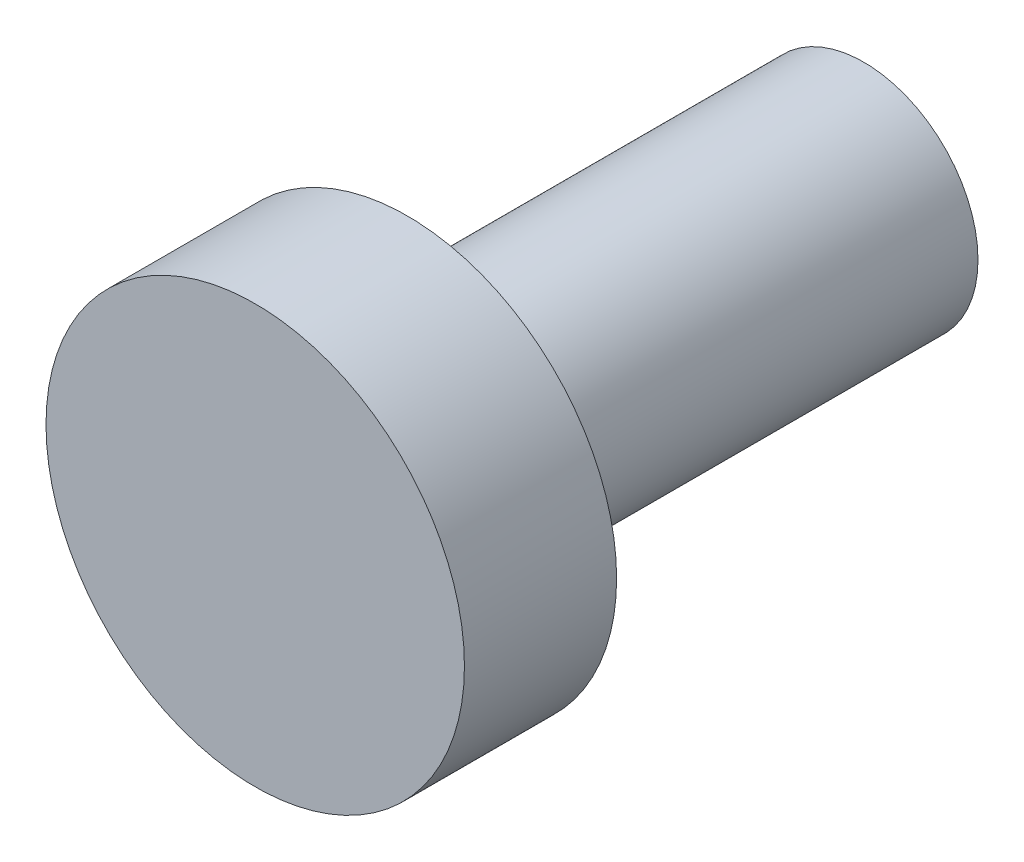
ISO-10303-21;
HEADER;
FILE_DESCRIPTION(('STEP AP214'),'2;1');
FILE_NAME('part.step','',(''),(''),'','','');
FILE_SCHEMA(('AUTOMOTIVE_DESIGN { 1 0 10303 214 1 1 1 1 }'));
ENDSEC;
DATA;
#1=APPLICATION_CONTEXT('core data for automotive mechanical design processes');
#2=APPLICATION_PROTOCOL_DEFINITION('international standard','automotive_design',2000,#1);
#3=PRODUCT_CONTEXT('',#1,'mechanical');
#4=PRODUCT('Part','Part','',(#3));
#5=PRODUCT_RELATED_PRODUCT_CATEGORY('part','',(#4));
#6=PRODUCT_DEFINITION_FORMATION('','',#4);
#7=PRODUCT_DEFINITION_CONTEXT('part definition',#1,'design');
#8=PRODUCT_DEFINITION('design','',#6,#7);
#9=PRODUCT_DEFINITION_SHAPE('','',#8);
#10=(LENGTH_UNIT() NAMED_UNIT(*) SI_UNIT(.MILLI.,.METRE.));
#11=(NAMED_UNIT(*) PLANE_ANGLE_UNIT() SI_UNIT($,.RADIAN.));
#12=(NAMED_UNIT(*) SI_UNIT($,.STERADIAN.) SOLID_ANGLE_UNIT());
#13=UNCERTAINTY_MEASURE_WITH_UNIT(LENGTH_MEASURE(1.E-05),#10,'distance_accuracy_value','');
#14=(GEOMETRIC_REPRESENTATION_CONTEXT(3) GLOBAL_UNCERTAINTY_ASSIGNED_CONTEXT((#13)) GLOBAL_UNIT_ASSIGNED_CONTEXT((#10,
#11,#12)) REPRESENTATION_CONTEXT('',''));
#15=CARTESIAN_POINT('',(0.,0.,0.));
#16=DIRECTION('',(0.,0.,1.));
#17=DIRECTION('',(1.,0.,0.));
#18=AXIS2_PLACEMENT_3D('',#15,#16,#17);
#19=CARTESIAN_POINT('',(0.,0.,0.));
#20=DIRECTION('',(0.,0.,-1.));
#21=DIRECTION('',(-1.,0.,0.));
#22=AXIS2_PLACEMENT_3D('',#19,#20,#21);
#23=CYLINDRICAL_SURFACE('',#22,1.5);
#24=CARTESIAN_POINT('',(0.,0.,0.));
#25=DIRECTION('',(0.,0.,1.));
#26=DIRECTION('',(1.,0.,0.));
#27=AXIS2_PLACEMENT_3D('',#24,#25,#26);
#28=CIRCLE('',#27,1.5);
#29=CARTESIAN_POINT('',(1.5,0.,0.));
#30=VERTEX_POINT('',#29);
#31=EDGE_CURVE('E10',#30,#30,#28,.T.);
#32=ORIENTED_EDGE('',*,*,#31,.F.);
#33=EDGE_LOOP('',(#32));
#34=FACE_BOUND('',#33,.T.);
#35=CARTESIAN_POINT('',(0.,0.,-6.));
#36=DIRECTION('',(0.,0.,1.));
#37=DIRECTION('',(1.,0.,0.));
#38=AXIS2_PLACEMENT_3D('',#35,#36,#37);
#39=CIRCLE('',#38,1.5);
#40=CARTESIAN_POINT('',(1.5,0.,-6.));
#41=VERTEX_POINT('',#40);
#42=EDGE_CURVE('E36',#41,#41,#39,.T.);
#43=ORIENTED_EDGE('',*,*,#42,.T.);
#44=EDGE_LOOP('',(#43));
#45=FACE_BOUND('',#44,.T.);
#46=ADVANCED_FACE('F33',(#34,#45),#23,.T.);
#47=CARTESIAN_POINT('',(0.,0.,-6.));
#48=DIRECTION('',(0.,0.,1.));
#49=DIRECTION('',(1.,0.,0.));
#50=AXIS2_PLACEMENT_3D('',#47,#48,#49);
#51=PLANE('',#50);
#52=ORIENTED_EDGE('',*,*,#42,.F.);
#53=EDGE_LOOP('',(#52));
#54=FACE_BOUND('',#53,.T.);
#55=ADVANCED_FACE('F56',(#54),#51,.F.);
#56=CARTESIAN_POINT('',(0.,0.,2.));
#57=DIRECTION('',(0.,0.,-1.));
#58=DIRECTION('',(-1.,0.,0.));
#59=AXIS2_PLACEMENT_3D('',#56,#57,#58);
#60=CYLINDRICAL_SURFACE('',#59,2.75);
#61=CARTESIAN_POINT('',(0.,0.,2.));
#62=DIRECTION('',(0.,0.,1.));
#63=DIRECTION('',(1.,0.,0.));
#64=AXIS2_PLACEMENT_3D('',#61,#62,#63);
#65=CIRCLE('',#64,2.75);
#66=CARTESIAN_POINT('',(2.75,0.,2.));
#67=VERTEX_POINT('',#66);
#68=EDGE_CURVE('E43',#67,#67,#65,.T.);
#69=ORIENTED_EDGE('',*,*,#68,.F.);
#70=EDGE_LOOP('',(#69));
#71=FACE_BOUND('',#70,.T.);
#72=CARTESIAN_POINT('',(0.,0.,0.));
#73=DIRECTION('',(0.,0.,1.));
#74=DIRECTION('',(1.,0.,0.));
#75=AXIS2_PLACEMENT_3D('',#72,#73,#74);
#76=CIRCLE('',#75,2.75);
#77=CARTESIAN_POINT('',(2.75,0.,0.));
#78=VERTEX_POINT('',#77);
#79=EDGE_CURVE('E45',#78,#78,#76,.T.);
#80=ORIENTED_EDGE('',*,*,#79,.T.);
#81=EDGE_LOOP('',(#80));
#82=FACE_BOUND('',#81,.T.);
#83=ADVANCED_FACE('F53',(#71,#82),#60,.T.);
#84=CARTESIAN_POINT('',(0.,0.,2.));
#85=DIRECTION('',(0.,0.,1.));
#86=DIRECTION('',(1.,0.,0.));
#87=AXIS2_PLACEMENT_3D('',#84,#85,#86);
#88=PLANE('',#87);
#89=ORIENTED_EDGE('',*,*,#68,.T.);
#90=EDGE_LOOP('',(#89));
#91=FACE_BOUND('',#90,.T.);
#92=ADVANCED_FACE('F51',(#91),#88,.T.);
#93=CARTESIAN_POINT('',(0.,0.,0.));
#94=DIRECTION('',(0.,0.,1.));
#95=DIRECTION('',(1.,0.,0.));
#96=AXIS2_PLACEMENT_3D('',#93,#94,#95);
#97=PLANE('',#96);
#98=ORIENTED_EDGE('',*,*,#31,.T.);
#99=EDGE_LOOP('',(#98));
#100=FACE_BOUND('',#99,.T.);
#101=ORIENTED_EDGE('',*,*,#79,.F.);
#102=EDGE_LOOP('',(#101));
#103=FACE_BOUND('',#102,.T.);
#104=ADVANCED_FACE('F60',(#100,#103),#97,.F.);
#105=CLOSED_SHELL('',(#46,#55,#83,#92,#104));
#106=MANIFOLD_SOLID_BREP('B2',#105);
#107=ADVANCED_BREP_SHAPE_REPRESENTATION('',(#18,#106),#14);
#108=SHAPE_DEFINITION_REPRESENTATION(#9,#107);
ENDSEC;
END-ISO-10303-21;
